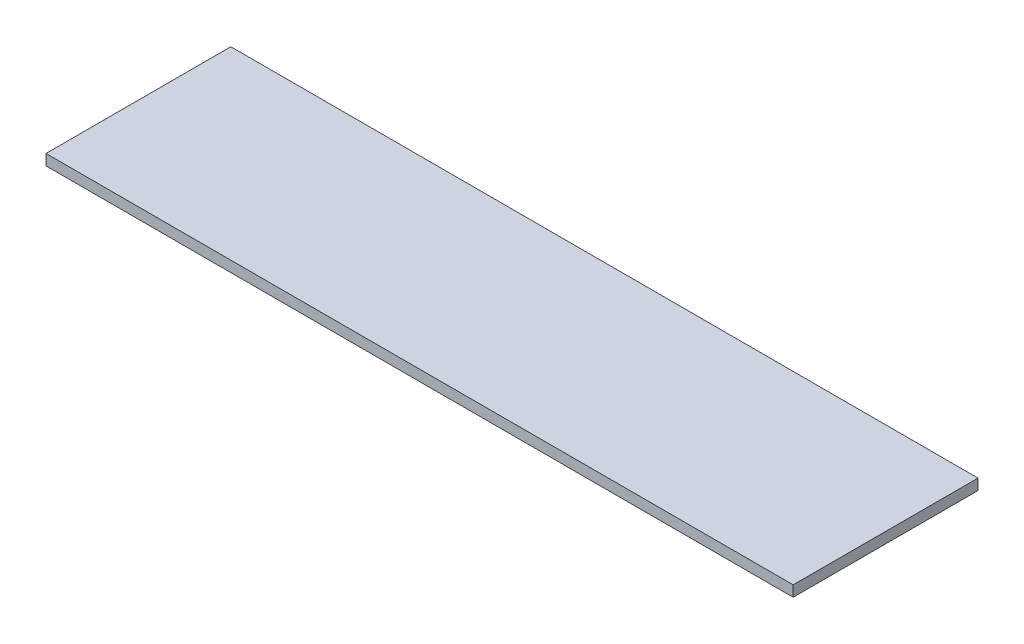
ISO-10303-21;
HEADER;
FILE_DESCRIPTION(('STEP AP214'),'2;1');
FILE_NAME('part.step','',(''),(''),'','','');
FILE_SCHEMA(('AUTOMOTIVE_DESIGN { 1 0 10303 214 1 1 1 1 }'));
ENDSEC;
DATA;
#1=APPLICATION_CONTEXT('core data for automotive mechanical design processes');
#2=APPLICATION_PROTOCOL_DEFINITION('international standard','automotive_design',2000,#1);
#3=PRODUCT_CONTEXT('',#1,'mechanical');
#4=PRODUCT('Part','Part','',(#3));
#5=PRODUCT_RELATED_PRODUCT_CATEGORY('part','',(#4));
#6=PRODUCT_DEFINITION_FORMATION('','',#4);
#7=PRODUCT_DEFINITION_CONTEXT('part definition',#1,'design');
#8=PRODUCT_DEFINITION('design','',#6,#7);
#9=PRODUCT_DEFINITION_SHAPE('','',#8);
#10=(LENGTH_UNIT() NAMED_UNIT(*) SI_UNIT(.MILLI.,.METRE.));
#11=(NAMED_UNIT(*) PLANE_ANGLE_UNIT() SI_UNIT($,.RADIAN.));
#12=(NAMED_UNIT(*) SI_UNIT($,.STERADIAN.) SOLID_ANGLE_UNIT());
#13=UNCERTAINTY_MEASURE_WITH_UNIT(LENGTH_MEASURE(1.E-05),#10,'distance_accuracy_value','');
#14=(GEOMETRIC_REPRESENTATION_CONTEXT(3) GLOBAL_UNCERTAINTY_ASSIGNED_CONTEXT((#13)) GLOBAL_UNIT_ASSIGNED_CONTEXT((#10,
#11,#12)) REPRESENTATION_CONTEXT('',''));
#15=CARTESIAN_POINT('',(0.,0.,0.));
#16=DIRECTION('',(0.,0.,1.));
#17=DIRECTION('',(1.,0.,0.));
#18=AXIS2_PLACEMENT_3D('',#15,#16,#17);
#19=CARTESIAN_POINT('',(0.,2.,0.));
#20=DIRECTION('',(1.,0.,0.));
#21=DIRECTION('',(0.,0.,-1.));
#22=AXIS2_PLACEMENT_3D('',#19,#20,#21);
#23=PLANE('',#22);
#24=DIRECTION('',(0.,0.,1.));
#25=VECTOR('',#24,1.);
#26=CARTESIAN_POINT('',(0.,0.,0.));
#27=LINE('',#26,#25);
#28=CARTESIAN_POINT('',(0.,0.,-34.25));
#29=VERTEX_POINT('',#28);
#30=CARTESIAN_POINT('',(0.,0.,0.));
#31=VERTEX_POINT('',#30);
#32=EDGE_CURVE('E111',#29,#31,#27,.T.);
#33=ORIENTED_EDGE('',*,*,#32,.T.);
#34=DIRECTION('',(0.,-1.,0.));
#35=VECTOR('',#34,1.);
#36=CARTESIAN_POINT('',(0.,2.,0.));
#37=LINE('',#36,#35);
#38=CARTESIAN_POINT('',(0.,2.,0.));
#39=VERTEX_POINT('',#38);
#40=EDGE_CURVE('E11',#39,#31,#37,.T.);
#41=ORIENTED_EDGE('',*,*,#40,.F.);
#42=DIRECTION('',(0.,0.,1.));
#43=VECTOR('',#42,1.);
#44=CARTESIAN_POINT('',(0.,2.,0.));
#45=LINE('',#44,#43);
#46=CARTESIAN_POINT('',(0.,2.,-34.25));
#47=VERTEX_POINT('',#46);
#48=EDGE_CURVE('E94',#47,#39,#45,.T.);
#49=ORIENTED_EDGE('',*,*,#48,.F.);
#50=DIRECTION('',(0.,-1.,0.));
#51=VECTOR('',#50,1.);
#52=CARTESIAN_POINT('',(0.,2.,-34.25));
#53=LINE('',#52,#51);
#54=EDGE_CURVE('E107',#47,#29,#53,.T.);
#55=ORIENTED_EDGE('',*,*,#54,.T.);
#56=EDGE_LOOP('',(#33,#41,#49,#55));
#57=FACE_BOUND('',#56,.T.);
#58=ADVANCED_FACE('F38',(#57),#23,.F.);
#59=CARTESIAN_POINT('',(0.,2.,0.));
#60=DIRECTION('',(0.,0.,-1.));
#61=DIRECTION('',(-1.,0.,0.));
#62=AXIS2_PLACEMENT_3D('',#59,#60,#61);
#63=PLANE('',#62);
#64=DIRECTION('',(1.,0.,0.));
#65=VECTOR('',#64,1.);
#66=CARTESIAN_POINT('',(0.,0.,0.));
#67=LINE('',#66,#65);
#68=CARTESIAN_POINT('',(138.45,0.,0.));
#69=VERTEX_POINT('',#68);
#70=EDGE_CURVE('E99',#31,#69,#67,.T.);
#71=ORIENTED_EDGE('',*,*,#70,.T.);
#72=DIRECTION('',(0.,-1.,0.));
#73=VECTOR('',#72,1.);
#74=CARTESIAN_POINT('',(138.45,2.,0.));
#75=LINE('',#74,#73);
#76=CARTESIAN_POINT('',(138.45,2.,0.));
#77=VERTEX_POINT('',#76);
#78=EDGE_CURVE('E47',#77,#69,#75,.T.);
#79=ORIENTED_EDGE('',*,*,#78,.F.);
#80=DIRECTION('',(1.,0.,0.));
#81=VECTOR('',#80,1.);
#82=CARTESIAN_POINT('',(0.,2.,0.));
#83=LINE('',#82,#81);
#84=EDGE_CURVE('E88',#39,#77,#83,.T.);
#85=ORIENTED_EDGE('',*,*,#84,.F.);
#86=ORIENTED_EDGE('',*,*,#40,.T.);
#87=EDGE_LOOP('',(#71,#79,#85,#86));
#88=FACE_BOUND('',#87,.T.);
#89=ADVANCED_FACE('F98',(#88),#63,.F.);
#90=CARTESIAN_POINT('',(138.45,2.,0.));
#91=DIRECTION('',(-1.,0.,0.));
#92=DIRECTION('',(0.,0.,1.));
#93=AXIS2_PLACEMENT_3D('',#90,#91,#92);
#94=PLANE('',#93);
#95=DIRECTION('',(0.,0.,-1.));
#96=VECTOR('',#95,1.);
#97=CARTESIAN_POINT('',(138.45,0.,0.));
#98=LINE('',#97,#96);
#99=CARTESIAN_POINT('',(138.45,0.,-34.25));
#100=VERTEX_POINT('',#99);
#101=EDGE_CURVE('E74',#69,#100,#98,.T.);
#102=ORIENTED_EDGE('',*,*,#101,.T.);
#103=DIRECTION('',(0.,-1.,0.));
#104=VECTOR('',#103,1.);
#105=CARTESIAN_POINT('',(138.45,2.,-34.25));
#106=LINE('',#105,#104);
#107=CARTESIAN_POINT('',(138.45,2.,-34.25));
#108=VERTEX_POINT('',#107);
#109=EDGE_CURVE('E101',#108,#100,#106,.T.);
#110=ORIENTED_EDGE('',*,*,#109,.F.);
#111=DIRECTION('',(0.,0.,-1.));
#112=VECTOR('',#111,1.);
#113=CARTESIAN_POINT('',(138.45,2.,0.));
#114=LINE('',#113,#112);
#115=EDGE_CURVE('E92',#77,#108,#114,.T.);
#116=ORIENTED_EDGE('',*,*,#115,.F.);
#117=ORIENTED_EDGE('',*,*,#78,.T.);
#118=EDGE_LOOP('',(#102,#110,#116,#117));
#119=FACE_BOUND('',#118,.T.);
#120=ADVANCED_FACE('F102',(#119),#94,.F.);
#121=CARTESIAN_POINT('',(0.,2.,-34.25));
#122=DIRECTION('',(0.,0.,1.));
#123=DIRECTION('',(1.,0.,0.));
#124=AXIS2_PLACEMENT_3D('',#121,#122,#123);
#125=PLANE('',#124);
#126=DIRECTION('',(-1.,0.,0.));
#127=VECTOR('',#126,1.);
#128=CARTESIAN_POINT('',(0.,0.,-34.25));
#129=LINE('',#128,#127);
#130=EDGE_CURVE('E80',#100,#29,#129,.T.);
#131=ORIENTED_EDGE('',*,*,#130,.T.);
#132=ORIENTED_EDGE('',*,*,#54,.F.);
#133=DIRECTION('',(-1.,0.,0.));
#134=VECTOR('',#133,1.);
#135=CARTESIAN_POINT('',(0.,2.,-34.25));
#136=LINE('',#135,#134);
#137=EDGE_CURVE('E55',#108,#47,#136,.T.);
#138=ORIENTED_EDGE('',*,*,#137,.F.);
#139=ORIENTED_EDGE('',*,*,#109,.T.);
#140=EDGE_LOOP('',(#131,#132,#138,#139));
#141=FACE_BOUND('',#140,.T.);
#142=ADVANCED_FACE('F119',(#141),#125,.F.);
#143=CARTESIAN_POINT('',(0.,2.,0.));
#144=DIRECTION('',(0.,-1.,0.));
#145=DIRECTION('',(0.,0.,-1.));
#146=AXIS2_PLACEMENT_3D('',#143,#144,#145);
#147=PLANE('',#146);
#148=ORIENTED_EDGE('',*,*,#48,.T.);
#149=ORIENTED_EDGE('',*,*,#84,.T.);
#150=ORIENTED_EDGE('',*,*,#115,.T.);
#151=ORIENTED_EDGE('',*,*,#137,.T.);
#152=EDGE_LOOP('',(#148,#149,#150,#151));
#153=FACE_BOUND('',#152,.T.);
#154=ADVANCED_FACE('F90',(#153),#147,.F.);
#155=CARTESIAN_POINT('',(0.,0.,0.));
#156=DIRECTION('',(0.,-1.,0.));
#157=DIRECTION('',(0.,0.,-1.));
#158=AXIS2_PLACEMENT_3D('',#155,#156,#157);
#159=PLANE('',#158);
#160=ORIENTED_EDGE('',*,*,#32,.F.);
#161=ORIENTED_EDGE('',*,*,#130,.F.);
#162=ORIENTED_EDGE('',*,*,#101,.F.);
#163=ORIENTED_EDGE('',*,*,#70,.F.);
#164=EDGE_LOOP('',(#160,#161,#162,#163));
#165=FACE_BOUND('',#164,.T.);
#166=ADVANCED_FACE('F122',(#165),#159,.T.);
#167=CLOSED_SHELL('',(#58,#89,#120,#142,#154,#166));
#168=MANIFOLD_SOLID_BREP('B2',#167);
#169=ADVANCED_BREP_SHAPE_REPRESENTATION('',(#18,#168),#14);
#170=SHAPE_DEFINITION_REPRESENTATION(#9,#169);
ENDSEC;
END-ISO-10303-21;
